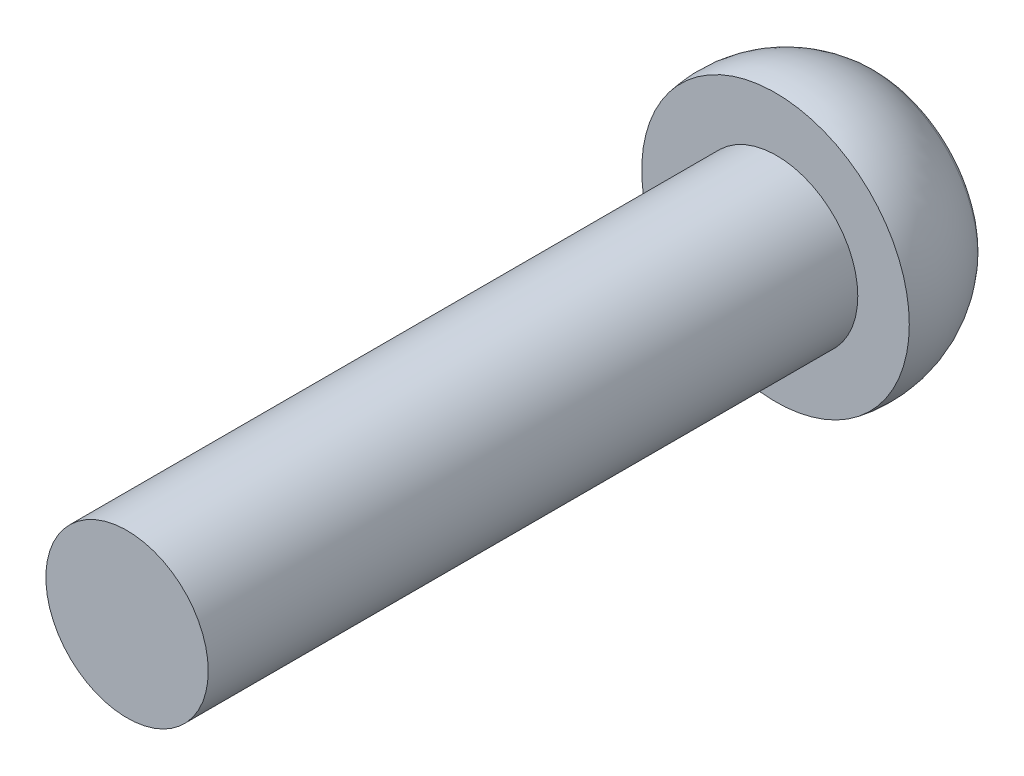
ISO-10303-21;
HEADER;
FILE_DESCRIPTION(('STEP AP214'),'2;1');
FILE_NAME('part.step','',(''),(''),'','','');
FILE_SCHEMA(('AUTOMOTIVE_DESIGN { 1 0 10303 214 1 1 1 1 }'));
ENDSEC;
DATA;
#1=APPLICATION_CONTEXT('core data for automotive mechanical design processes');
#2=APPLICATION_PROTOCOL_DEFINITION('international standard','automotive_design',2000,#1);
#3=PRODUCT_CONTEXT('',#1,'mechanical');
#4=PRODUCT('Part','Part','',(#3));
#5=PRODUCT_RELATED_PRODUCT_CATEGORY('part','',(#4));
#6=PRODUCT_DEFINITION_FORMATION('','',#4);
#7=PRODUCT_DEFINITION_CONTEXT('part definition',#1,'design');
#8=PRODUCT_DEFINITION('design','',#6,#7);
#9=PRODUCT_DEFINITION_SHAPE('','',#8);
#10=(LENGTH_UNIT() NAMED_UNIT(*) SI_UNIT(.MILLI.,.METRE.));
#11=(NAMED_UNIT(*) PLANE_ANGLE_UNIT() SI_UNIT($,.RADIAN.));
#12=(NAMED_UNIT(*) SI_UNIT($,.STERADIAN.) SOLID_ANGLE_UNIT());
#13=UNCERTAINTY_MEASURE_WITH_UNIT(LENGTH_MEASURE(1.E-05),#10,'distance_accuracy_value','');
#14=(GEOMETRIC_REPRESENTATION_CONTEXT(3) GLOBAL_UNCERTAINTY_ASSIGNED_CONTEXT((#13)) GLOBAL_UNIT_ASSIGNED_CONTEXT((#10,
#11,#12)) REPRESENTATION_CONTEXT('',''));
#15=CARTESIAN_POINT('',(0.,0.,0.));
#16=DIRECTION('',(0.,0.,1.));
#17=DIRECTION('',(1.,0.,0.));
#18=AXIS2_PLACEMENT_3D('',#15,#16,#17);
#19=CARTESIAN_POINT('',(0.,0.,0.));
#20=DIRECTION('',(0.,0.,1.));
#21=DIRECTION('',(1.,0.,0.));
#22=AXIS2_PLACEMENT_3D('',#19,#20,#21);
#23=PLANE('',#22);
#24=CARTESIAN_POINT('',(0.,0.,0.));
#25=DIRECTION('',(0.,0.,1.));
#26=DIRECTION('',(1.,0.,0.));
#27=AXIS2_PLACEMENT_3D('',#24,#25,#26);
#28=CIRCLE('',#27,1.64786324972712);
#29=CARTESIAN_POINT('',(1.64786324972712,0.,0.));
#30=VERTEX_POINT('',#29);
#31=EDGE_CURVE('E204',#30,#30,#28,.T.);
#32=ORIENTED_EDGE('',*,*,#31,.T.);
#33=EDGE_LOOP('',(#32));
#34=FACE_BOUND('',#33,.T.);
#35=CARTESIAN_POINT('',(0.0135896024399493,-0.0135896024399496,0.));
#36=DIRECTION('',(0.,0.,1.));
#37=DIRECTION('',(1.,0.,0.));
#38=AXIS2_PLACEMENT_3D('',#35,#36,#37);
#39=CIRCLE('',#38,1.);
#40=CARTESIAN_POINT('',(1.01358960243995,-0.0135896024399496,0.));
#41=VERTEX_POINT('',#40);
#42=EDGE_CURVE('E344',#41,#41,#39,.T.);
#43=ORIENTED_EDGE('',*,*,#42,.F.);
#44=EDGE_LOOP('',(#43));
#45=FACE_BOUND('',#44,.T.);
#46=ADVANCED_FACE('F35',(#34,#45),#23,.T.);
#47=CARTESIAN_POINT('',(0.,0.,-1.34074998965091));
#48=DIRECTION('',(0.,0.,-1.));
#49=DIRECTION('',(-1.,0.,0.));
#50=AXIS2_PLACEMENT_3D('',#47,#48,#49);
#51=PLANE('',#50);
#52=DIRECTION('',(0.,-1.,0.));
#53=VECTOR('',#52,1.);
#54=CARTESIAN_POINT('',(0.25,-0.25,-1.34074998965091));
#55=LINE('',#54,#53);
#56=CARTESIAN_POINT('',(0.25,-0.25,-1.34074998965091));
#57=VERTEX_POINT('',#56);
#58=CARTESIAN_POINT('',(0.25,-0.912522745887616,-1.34074998965091));
#59=VERTEX_POINT('',#58);
#60=EDGE_CURVE('E323',#57,#59,#55,.T.);
#61=ORIENTED_EDGE('',*,*,#60,.F.);
#62=DIRECTION('',(-1.,0.,0.));
#63=VECTOR('',#62,1.);
#64=CARTESIAN_POINT('',(1.,-0.25,-1.34074998965091));
#65=LINE('',#64,#63);
#66=CARTESIAN_POINT('',(0.912522745887616,-0.25,-1.34074998965091));
#67=VERTEX_POINT('',#66);
#68=EDGE_CURVE('E357',#67,#57,#65,.T.);
#69=ORIENTED_EDGE('',*,*,#68,.F.);
#70=CARTESIAN_POINT('',(0.,0.,-1.34074998965091));
#71=DIRECTION('',(0.,0.,1.));
#72=DIRECTION('',(1.,0.,0.));
#73=AXIS2_PLACEMENT_3D('',#70,#71,#72);
#74=CIRCLE('',#73,0.946148910987205);
#75=EDGE_CURVE('E210',#59,#67,#74,.T.);
#76=ORIENTED_EDGE('',*,*,#75,.F.);
#77=EDGE_LOOP('',(#61,#69,#76));
#78=FACE_BOUND('',#77,.T.);
#79=ADVANCED_FACE('F384',(#78),#51,.T.);
#80=DIRECTION('',(1.,0.,0.));
#81=VECTOR('',#80,1.);
#82=CARTESIAN_POINT('',(1.,0.25,-1.34074998965091));
#83=LINE('',#82,#81);
#84=CARTESIAN_POINT('',(0.25,0.25,-1.34074998965091));
#85=VERTEX_POINT('',#84);
#86=CARTESIAN_POINT('',(0.912522745887616,0.25,-1.34074998965091));
#87=VERTEX_POINT('',#86);
#88=EDGE_CURVE('E355',#85,#87,#83,.T.);
#89=ORIENTED_EDGE('',*,*,#88,.F.);
#90=DIRECTION('',(0.,-1.,0.));
#91=VECTOR('',#90,1.);
#92=CARTESIAN_POINT('',(0.25,1.,-1.34074998965091));
#93=LINE('',#92,#91);
#94=CARTESIAN_POINT('',(0.25,0.912522745887616,-1.34074998965091));
#95=VERTEX_POINT('',#94);
#96=EDGE_CURVE('E352',#95,#85,#93,.T.);
#97=ORIENTED_EDGE('',*,*,#96,.F.);
#98=EDGE_CURVE('E211',#87,#95,#74,.T.);
#99=ORIENTED_EDGE('',*,*,#98,.F.);
#100=EDGE_LOOP('',(#89,#97,#99));
#101=FACE_BOUND('',#100,.T.);
#102=ADVANCED_FACE('F405',(#101),#51,.T.);
#103=DIRECTION('',(0.,1.,0.));
#104=VECTOR('',#103,1.);
#105=CARTESIAN_POINT('',(-0.25,1.,-1.34074998965091));
#106=LINE('',#105,#104);
#107=CARTESIAN_POINT('',(-0.25,0.25,-1.34074998965091));
#108=VERTEX_POINT('',#107);
#109=CARTESIAN_POINT('',(-0.25,0.912522745887616,-1.34074998965091));
#110=VERTEX_POINT('',#109);
#111=EDGE_CURVE('E350',#108,#110,#106,.T.);
#112=ORIENTED_EDGE('',*,*,#111,.F.);
#113=DIRECTION('',(1.,0.,0.));
#114=VECTOR('',#113,1.);
#115=CARTESIAN_POINT('',(-0.25,0.25,-1.34074998965091));
#116=LINE('',#115,#114);
#117=CARTESIAN_POINT('',(-0.912522745887616,0.25,-1.34074998965091));
#118=VERTEX_POINT('',#117);
#119=EDGE_CURVE('E341',#118,#108,#116,.T.);
#120=ORIENTED_EDGE('',*,*,#119,.F.);
#121=EDGE_CURVE('E214',#110,#118,#74,.T.);
#122=ORIENTED_EDGE('',*,*,#121,.F.);
#123=EDGE_LOOP('',(#112,#120,#122));
#124=FACE_BOUND('',#123,.T.);
#125=ADVANCED_FACE('F393',(#124),#51,.T.);
#126=DIRECTION('',(0.,1.,0.));
#127=VECTOR('',#126,1.);
#128=CARTESIAN_POINT('',(-0.25,-0.25,-1.34074998965091));
#129=LINE('',#128,#127);
#130=CARTESIAN_POINT('',(-0.25,-0.912522745887616,-1.34074998965091));
#131=VERTEX_POINT('',#130);
#132=CARTESIAN_POINT('',(-0.25,-0.25,-1.34074998965091));
#133=VERTEX_POINT('',#132);
#134=EDGE_CURVE('E336',#131,#133,#129,.T.);
#135=ORIENTED_EDGE('',*,*,#134,.F.);
#136=CARTESIAN_POINT('',(-0.912522745887616,-0.25,-1.34074998965091));
#137=VERTEX_POINT('',#136);
#138=EDGE_CURVE('E332',#137,#131,#74,.T.);
#139=ORIENTED_EDGE('',*,*,#138,.F.);
#140=DIRECTION('',(-1.,0.,0.));
#141=VECTOR('',#140,1.);
#142=CARTESIAN_POINT('',(-0.25,-0.25,-1.34074998965091));
#143=LINE('',#142,#141);
#144=EDGE_CURVE('E54',#133,#137,#143,.T.);
#145=ORIENTED_EDGE('',*,*,#144,.F.);
#146=EDGE_LOOP('',(#135,#139,#145));
#147=FACE_BOUND('',#146,.T.);
#148=ADVANCED_FACE('F338',(#147),#51,.T.);
#149=CARTESIAN_POINT('',(0.,0.,-0.840749989650906));
#150=DIRECTION('',(0.,0.,1.));
#151=DIRECTION('',(1.,0.,0.));
#152=AXIS2_PLACEMENT_3D('',#149,#150,#151);
#153=TOROIDAL_SURFACE('',#152,0.946148910987205,0.5);
#154=CARTESIAN_POINT('',(-0.248731418139729,-1.00019999999798,-1.33355550441005));
#155=CARTESIAN_POINT('',(-0.24958614674247,-0.970985632246849,-1.33840291119549));
#156=CARTESIAN_POINT('',(-0.250008527124177,-0.941356796484875,-1.34079834937522));
#157=CARTESIAN_POINT('',(-0.249991262751628,-0.882089876302517,-1.34070043825306));
#158=CARTESIAN_POINT('',(-0.249551119047547,-0.85245179645112,-1.33820425926608));
#159=CARTESIAN_POINT('',(-0.247809665705305,-0.793993999996859,-1.32832798658651));
#160=CARTESIAN_POINT('',(-0.246507536336563,-0.765175089641474,-1.32094324397078));
#161=CARTESIAN_POINT('',(-0.243070557403056,-0.709267037425154,-1.30145116783077));
#162=CARTESIAN_POINT('',(-0.240936699840295,-0.682175879498399,-1.28934946022943));
#163=CARTESIAN_POINT('',(-0.235964122234399,-0.63141444611803,-1.26114857125648));
#164=CARTESIAN_POINT('',(-0.233151434951457,-0.607659926555948,-1.24519702900446));
#165=CARTESIAN_POINT('',(-0.226841694587375,-0.563251924748829,-1.20941271319113));
#166=CARTESIAN_POINT('',(-0.223342242870993,-0.542609773111442,-1.18956633629338));
#167=CARTESIAN_POINT('',(-0.219536364668565,-0.523969633910927,-1.16798212843628));
#168=B_SPLINE_CURVE_WITH_KNOTS('',3,(#154,#155,#156,#157,#158,#159,#160,#161,#162,#163,#164,
#165,#166,#167),.UNSPECIFIED.,.F.,.F.,(4,2,2,2,2,2,4),(0.,0.0887691650607502,0.177589696147095,
0.266494815301146,0.355294220222159,0.441116211611775,0.527243463159091),.UNSPECIFIED.);
#169=CARTESIAN_POINT('',(-0.248772653500362,-0.998772653500362,-1.33378936176114));
#170=VERTEX_POINT('',#169);
#171=EDGE_CURVE('E11',#170,#131,#168,.T.);
#172=ORIENTED_EDGE('',*,*,#171,.F.);
#173=CARTESIAN_POINT('',(0.2502,-0.998762636472414,-1.33373255237265));
#174=CARTESIAN_POINT('',(0.22935821029771,-0.998909155419599,-1.33456350261405));
#175=CARTESIAN_POINT('',(0.208510714237745,-0.99902632673639,-1.33522801417274));
#176=CARTESIAN_POINT('',(0.166810073600685,-0.999214972415781,-1.33629787698463));
#177=CARTESIAN_POINT('',(0.145956929482305,-0.999286449767193,-1.3367032451882));
#178=CARTESIAN_POINT('',(0.0834051338906349,-0.999451826949895,-1.33764114579784));
#179=CARTESIAN_POINT('',(0.0417025669453174,-0.999496738672754,-1.33789585283518));
#180=CARTESIAN_POINT('',(-0.0417025669453178,-0.999496738672754,-1.33789585283518));
#181=CARTESIAN_POINT('',(-0.0834051338906354,-0.999451826949895,-1.33764114579784));
#182=CARTESIAN_POINT('',(-0.145956929482306,-0.999286449767193,-1.3367032451882));
#183=CARTESIAN_POINT('',(-0.166810073600686,-0.999214972415781,-1.33629787698463));
#184=CARTESIAN_POINT('',(-0.208510714237745,-0.99902632673639,-1.33522801417274));
#185=CARTESIAN_POINT('',(-0.22935821029771,-0.998909155419599,-1.33456350261405));
#186=CARTESIAN_POINT('',(-0.2502,-0.998762636472414,-1.33373255237265));
#187=B_SPLINE_CURVE_WITH_KNOTS('',3,(#173,#174,#175,#176,#177,#178,#179,#180,#181,#182,#183,
#184,#185,#186),.UNSPECIFIED.,.F.,.F.,(4,2,2,2,2,2,4),(0.,0.0625742628865592,0.125144432413641,
0.250250102299897,0.375355772186154,0.437925941713235,0.500500204599794),.UNSPECIFIED.);
#188=CARTESIAN_POINT('',(0.248772653499892,-0.998772653499892,-1.33378936175847));
#189=VERTEX_POINT('',#188);
#190=EDGE_CURVE('E47',#189,#170,#187,.T.);
#191=ORIENTED_EDGE('',*,*,#190,.F.);
#192=CARTESIAN_POINT('',(0.219536364668565,-0.523969633910927,-1.16798212843628));
#193=CARTESIAN_POINT('',(0.223417162959779,-0.542973823364192,-1.18999122923084));
#194=CARTESIAN_POINT('',(0.22697935323117,-0.564063715021397,-1.210193414155));
#195=CARTESIAN_POINT('',(0.23338358711039,-0.609458557906342,-1.2465136293228));
#196=CARTESIAN_POINT('',(0.236228669439464,-0.633749255233126,-1.262648893011));
#197=CARTESIAN_POINT('',(0.241004749968007,-0.683258284015449,-1.28973539168155));
#198=CARTESIAN_POINT('',(0.24297988223307,-0.708336626868522,-1.30093692338774));
#199=CARTESIAN_POINT('',(0.246219254039212,-0.76000121173847,-1.3193083138189));
#200=CARTESIAN_POINT('',(0.247482662017373,-0.78658917782316,-1.3264734565162));
#201=CARTESIAN_POINT('',(0.249394296316473,-0.844287328167994,-1.33731487336245));
#202=CARTESIAN_POINT('',(0.249934375709412,-0.875517583212375,-1.34037781580477));
#203=CARTESIAN_POINT('',(0.250054829507455,-0.938055105897448,-1.34106094323972));
#204=CARTESIAN_POINT('',(0.249634703786009,-0.969362405183311,-1.33867829187373));
#205=CARTESIAN_POINT('',(0.248731418139729,-1.00019999999798,-1.33355550441005));
#206=B_SPLINE_CURVE_WITH_KNOTS('',3,(#192,#193,#194,#195,#196,#197,#198,#199,#200,#201,#202,
#203,#204,#205),.UNSPECIFIED.,.F.,.F.,(4,2,2,2,2,2,4),(0.,0.0878170982428003,0.175255569681402,
0.257519005261126,0.339878357327818,0.43353414273552,0.527238720237572),.UNSPECIFIED.);
#207=EDGE_CURVE('E298',#59,#189,#206,.T.);
#208=ORIENTED_EDGE('',*,*,#207,.F.);
#209=ORIENTED_EDGE('',*,*,#75,.T.);
#210=CARTESIAN_POINT('',(1.00019999999798,-0.248731418139729,-1.33355550441005));
#211=CARTESIAN_POINT('',(0.970985632246848,-0.24958614674247,-1.33840291119549));
#212=CARTESIAN_POINT('',(0.941356796484875,-0.250008527124176,-1.34079834937522));
#213=CARTESIAN_POINT('',(0.882089876302517,-0.249991262751628,-1.34070043825306));
#214=CARTESIAN_POINT('',(0.85245179645112,-0.249551119047546,-1.33820425926608));
#215=CARTESIAN_POINT('',(0.793993999996859,-0.247809665705305,-1.32832798658651));
#216=CARTESIAN_POINT('',(0.765175089641474,-0.246507536336563,-1.32094324397078));
#217=CARTESIAN_POINT('',(0.709267037425154,-0.243070557403056,-1.30145116783077));
#218=CARTESIAN_POINT('',(0.682175879498399,-0.240936699840295,-1.28934946022943));
#219=CARTESIAN_POINT('',(0.631414446117999,-0.235964122234396,-1.26114857125646));
#220=CARTESIAN_POINT('',(0.60765992655589,-0.23315143495145,-1.24519702900442));
#221=CARTESIAN_POINT('',(0.563251924748724,-0.226841694587359,-1.20941271319104));
#222=CARTESIAN_POINT('',(0.542609773111318,-0.223342242870971,-1.18956633629326));
#223=CARTESIAN_POINT('',(0.52396963391079,-0.219536364668537,-1.16798212843612));
#224=B_SPLINE_CURVE_WITH_KNOTS('',3,(#210,#211,#212,#213,#214,#215,#216,#217,#218,#219,#220,
#221,#222,#223),.UNSPECIFIED.,.F.,.F.,(4,2,2,2,2,2,4),(0.,0.0887691650607503,0.177589696147095,
0.266494815301146,0.355294220222159,0.441116211611879,0.527243463159302),.UNSPECIFIED.);
#225=CARTESIAN_POINT('',(0.998772653500362,-0.248772653500362,-1.33378936176114));
#226=VERTEX_POINT('',#225);
#227=EDGE_CURVE('E293',#226,#67,#224,.T.);
#228=ORIENTED_EDGE('',*,*,#227,.F.);
#229=CARTESIAN_POINT('',(0.998762636472414,0.2502,-1.33373255237265));
#230=CARTESIAN_POINT('',(0.998909155419599,0.22935821029771,-1.33456350261405));
#231=CARTESIAN_POINT('',(0.99902632673639,0.208510714237745,-1.33522801417274));
#232=CARTESIAN_POINT('',(0.999214972415781,0.166810073600685,-1.33629787698463));
#233=CARTESIAN_POINT('',(0.999286449767193,0.145956929482306,-1.3367032451882));
#234=CARTESIAN_POINT('',(0.999451826949894,0.0834051338906351,-1.33764114579784));
#235=CARTESIAN_POINT('',(0.999496738672753,0.0417025669453175,-1.33789585283518));
#236=CARTESIAN_POINT('',(0.999496738672753,-0.0417025669453176,-1.33789585283518));
#237=CARTESIAN_POINT('',(0.999451826949894,-0.0834051338906352,-1.33764114579784));
#238=CARTESIAN_POINT('',(0.999286449767193,-0.145956929482306,-1.3367032451882));
#239=CARTESIAN_POINT('',(0.999214972415781,-0.166810073600686,-1.33629787698463));
#240=CARTESIAN_POINT('',(0.99902632673639,-0.208510714237745,-1.33522801417274));
#241=CARTESIAN_POINT('',(0.998909155419599,-0.22935821029771,-1.33456350261405));
#242=CARTESIAN_POINT('',(0.998762636472414,-0.2502,-1.33373255237265));
#243=B_SPLINE_CURVE_WITH_KNOTS('',3,(#229,#230,#231,#232,#233,#234,#235,#236,#237,#238,#239,
#240,#241,#242),.UNSPECIFIED.,.F.,.F.,(4,2,2,2,2,2,4),(0.,0.0625742628865592,0.125144432413641,
0.250250102299897,0.375355772186154,0.437925941713235,0.500500204599794),.UNSPECIFIED.);
#244=CARTESIAN_POINT('',(0.998772653499892,0.248772653499892,-1.33378936175847));
#245=VERTEX_POINT('',#244);
#246=EDGE_CURVE('E288',#245,#226,#243,.T.);
#247=ORIENTED_EDGE('',*,*,#246,.F.);
#248=CARTESIAN_POINT('',(0.52396963391079,0.219536364668537,-1.16798212843612));
#249=CARTESIAN_POINT('',(0.542973823364044,0.223417162959752,-1.18999122923069));
#250=CARTESIAN_POINT('',(0.564063715021239,0.226979353231145,-1.21019341415486));
#251=CARTESIAN_POINT('',(0.609458557906166,0.233383587110368,-1.24651362932268));
#252=CARTESIAN_POINT('',(0.633749255232941,0.236228669439444,-1.26264889301088));
#253=CARTESIAN_POINT('',(0.683258284015249,0.24100474996799,-1.28973539168145));
#254=CARTESIAN_POINT('',(0.708336626868314,0.242979882233055,-1.30093692338765));
#255=CARTESIAN_POINT('',(0.76000121173825,0.246219254039201,-1.31930831381883));
#256=CARTESIAN_POINT('',(0.786589177822934,0.247482662017364,-1.32647345651615));
#257=CARTESIAN_POINT('',(0.844287328167799,0.249394296316469,-1.33731487336242));
#258=CARTESIAN_POINT('',(0.875517583212219,0.249934375709411,-1.34037781580476));
#259=CARTESIAN_POINT('',(0.93805510589737,0.250054829507456,-1.34106094323972));
#260=CARTESIAN_POINT('',(0.969362405183272,0.24963470378601,-1.33867829187373));
#261=CARTESIAN_POINT('',(1.00019999999798,0.248731418139729,-1.33355550441005));
#262=B_SPLINE_CURVE_WITH_KNOTS('',3,(#248,#249,#250,#251,#252,#253,#254,#255,#256,#257,#258,
#259,#260,#261),.UNSPECIFIED.,.F.,.F.,(4,2,2,2,2,2,4),(0.,0.0878170982427962,0.175255569681394,
0.25751900526111,0.339878357327794,0.433534142735613,0.527238720237782),.UNSPECIFIED.);
#263=EDGE_CURVE('E283',#87,#245,#262,.T.);
#264=ORIENTED_EDGE('',*,*,#263,.F.);
#265=ORIENTED_EDGE('',*,*,#98,.T.);
#266=CARTESIAN_POINT('',(0.248731418139729,1.00019999999798,-1.33355550441005));
#267=CARTESIAN_POINT('',(0.24958614674247,0.970985632246848,-1.33840291119549));
#268=CARTESIAN_POINT('',(0.250008527124176,0.941356796484875,-1.34079834937522));
#269=CARTESIAN_POINT('',(0.249991262751628,0.882089876302516,-1.34070043825306));
#270=CARTESIAN_POINT('',(0.249551119047547,0.85245179645112,-1.33820425926608));
#271=CARTESIAN_POINT('',(0.247809665705305,0.793993999996859,-1.32832798658651));
#272=CARTESIAN_POINT('',(0.246507536336563,0.765175089641474,-1.32094324397078));
#273=CARTESIAN_POINT('',(0.243070557403056,0.709267037425154,-1.30145116783077));
#274=CARTESIAN_POINT('',(0.240936699840295,0.682175879498399,-1.28934946022943));
#275=CARTESIAN_POINT('',(0.235964122234396,0.631414446117999,-1.26114857125646));
#276=CARTESIAN_POINT('',(0.23315143495145,0.60765992655589,-1.24519702900442));
#277=CARTESIAN_POINT('',(0.226841694587359,0.563251924748724,-1.20941271319104));
#278=CARTESIAN_POINT('',(0.223342242870971,0.542609773111318,-1.18956633629326));
#279=CARTESIAN_POINT('',(0.219536364668537,0.523969633910789,-1.16798212843612));
#280=B_SPLINE_CURVE_WITH_KNOTS('',3,(#266,#267,#268,#269,#270,#271,#272,#273,#274,#275,#276,
#277,#278,#279),.UNSPECIFIED.,.F.,.F.,(4,2,2,2,2,2,4),(0.,0.0887691650607504,0.177589696147095,
0.266494815301146,0.355294220222159,0.441116211611879,0.527243463159301),.UNSPECIFIED.);
#281=CARTESIAN_POINT('',(0.248772653500362,0.998772653500362,-1.33378936176114));
#282=VERTEX_POINT('',#281);
#283=EDGE_CURVE('E260',#282,#95,#280,.T.);
#284=ORIENTED_EDGE('',*,*,#283,.F.);
#285=CARTESIAN_POINT('',(-0.2502,0.998762636472413,-1.33373255237265));
#286=CARTESIAN_POINT('',(-0.22935821029771,0.998909155419599,-1.33456350261405));
#287=CARTESIAN_POINT('',(-0.208510714237745,0.999026326736389,-1.33522801417274));
#288=CARTESIAN_POINT('',(-0.166810073600685,0.999214972415781,-1.33629787698463));
#289=CARTESIAN_POINT('',(-0.145956929482306,0.999286449767193,-1.3367032451882));
#290=CARTESIAN_POINT('',(-0.0834051338906351,0.999451826949894,-1.33764114579784));
#291=CARTESIAN_POINT('',(-0.0417025669453175,0.999496738672753,-1.33789585283518));
#292=CARTESIAN_POINT('',(0.0417025669453176,0.999496738672753,-1.33789585283518));
#293=CARTESIAN_POINT('',(0.0834051338906352,0.999451826949894,-1.33764114579784));
#294=CARTESIAN_POINT('',(0.145956929482306,0.999286449767193,-1.3367032451882));
#295=CARTESIAN_POINT('',(0.166810073600686,0.999214972415781,-1.33629787698463));
#296=CARTESIAN_POINT('',(0.208510714237745,0.999026326736389,-1.33522801417274));
#297=CARTESIAN_POINT('',(0.22935821029771,0.998909155419599,-1.33456350261405));
#298=CARTESIAN_POINT('',(0.2502,0.998762636472413,-1.33373255237265));
#299=B_SPLINE_CURVE_WITH_KNOTS('',3,(#285,#286,#287,#288,#289,#290,#291,#292,#293,#294,#295,
#296,#297,#298),.UNSPECIFIED.,.F.,.F.,(4,2,2,2,2,2,4),(0.,0.0625742628865592,0.125144432413641,
0.250250102299897,0.375355772186154,0.437925941713235,0.500500204599794),.UNSPECIFIED.);
#300=CARTESIAN_POINT('',(-0.248772653499892,0.998772653499892,-1.33378936175847));
#301=VERTEX_POINT('',#300);
#302=EDGE_CURVE('E255',#301,#282,#299,.T.);
#303=ORIENTED_EDGE('',*,*,#302,.F.);
#304=CARTESIAN_POINT('',(-0.219536364668537,0.52396963391079,-1.16798212843612));
#305=CARTESIAN_POINT('',(-0.223417162959752,0.542973823364044,-1.18999122923069));
#306=CARTESIAN_POINT('',(-0.226979353231145,0.564063715021239,-1.21019341415486));
#307=CARTESIAN_POINT('',(-0.233383587110368,0.609458557906166,-1.24651362932268));
#308=CARTESIAN_POINT('',(-0.236228669439444,0.633749255232941,-1.26264889301088));
#309=CARTESIAN_POINT('',(-0.24100474996799,0.683258284015249,-1.28973539168145));
#310=CARTESIAN_POINT('',(-0.242979882233055,0.708336626868314,-1.30093692338765));
#311=CARTESIAN_POINT('',(-0.246219254039201,0.76000121173825,-1.31930831381883));
#312=CARTESIAN_POINT('',(-0.247482662017364,0.786589177822934,-1.32647345651615));
#313=CARTESIAN_POINT('',(-0.249394296316469,0.844287328167799,-1.33731487336242));
#314=CARTESIAN_POINT('',(-0.249934375709411,0.875517583212218,-1.34037781580476));
#315=CARTESIAN_POINT('',(-0.250054829507456,0.938055105897369,-1.34106094323972));
#316=CARTESIAN_POINT('',(-0.24963470378601,0.969362405183272,-1.33867829187373));
#317=CARTESIAN_POINT('',(-0.248731418139729,1.00019999999798,-1.33355550441005));
#318=B_SPLINE_CURVE_WITH_KNOTS('',3,(#304,#305,#306,#307,#308,#309,#310,#311,#312,#313,#314,
#315,#316,#317),.UNSPECIFIED.,.F.,.F.,(4,2,2,2,2,2,4),(0.,0.0878170982427962,0.175255569681394,
0.25751900526111,0.339878357327794,0.433534142735613,0.527238720237782),.UNSPECIFIED.);
#319=EDGE_CURVE('E250',#110,#301,#318,.T.);
#320=ORIENTED_EDGE('',*,*,#319,.F.);
#321=ORIENTED_EDGE('',*,*,#121,.T.);
#322=CARTESIAN_POINT('',(-1.00019999999798,0.248731418139729,-1.33355550441005));
#323=CARTESIAN_POINT('',(-0.970985632246848,0.24958614674247,-1.33840291119549));
#324=CARTESIAN_POINT('',(-0.941356796484875,0.250008527124176,-1.34079834937522));
#325=CARTESIAN_POINT('',(-0.882089876302517,0.249991262751628,-1.34070043825306));
#326=CARTESIAN_POINT('',(-0.85245179645112,0.249551119047546,-1.33820425926608));
#327=CARTESIAN_POINT('',(-0.793993999996859,0.247809665705305,-1.32832798658651));
#328=CARTESIAN_POINT('',(-0.765175089641474,0.246507536336563,-1.32094324397078));
#329=CARTESIAN_POINT('',(-0.709267037425154,0.243070557403056,-1.30145116783077));
#330=CARTESIAN_POINT('',(-0.682175879498399,0.240936699840295,-1.28934946022943));
#331=CARTESIAN_POINT('',(-0.63141444611803,0.235964122234399,-1.26114857125648));
#332=CARTESIAN_POINT('',(-0.607659926555948,0.233151434951457,-1.24519702900446));
#333=CARTESIAN_POINT('',(-0.563251924748829,0.226841694587375,-1.20941271319113));
#334=CARTESIAN_POINT('',(-0.542609773111442,0.223342242870993,-1.18956633629338));
#335=CARTESIAN_POINT('',(-0.523969633910927,0.219536364668565,-1.16798212843628));
#336=B_SPLINE_CURVE_WITH_KNOTS('',3,(#322,#323,#324,#325,#326,#327,#328,#329,#330,#331,#332,
#333,#334,#335),.UNSPECIFIED.,.F.,.F.,(4,2,2,2,2,2,4),(0.,0.0887691650607503,0.177589696147095,
0.266494815301146,0.355294220222159,0.441116211611775,0.527243463159091),.UNSPECIFIED.);
#337=CARTESIAN_POINT('',(-0.998772653500362,0.248772653500362,-1.33378936176114));
#338=VERTEX_POINT('',#337);
#339=EDGE_CURVE('E245',#338,#118,#336,.T.);
#340=ORIENTED_EDGE('',*,*,#339,.F.);
#341=CARTESIAN_POINT('',(-0.998762636472414,-0.2502,-1.33373255237265));
#342=CARTESIAN_POINT('',(-0.998909155419599,-0.22935821029771,-1.33456350261405));
#343=CARTESIAN_POINT('',(-0.99902632673639,-0.208510714237745,-1.33522801417274));
#344=CARTESIAN_POINT('',(-0.999214972415781,-0.166810073600686,-1.33629787698463));
#345=CARTESIAN_POINT('',(-0.999286449767193,-0.145956929482306,-1.3367032451882));
#346=CARTESIAN_POINT('',(-0.999451826949894,-0.0834051338906352,-1.33764114579784));
#347=CARTESIAN_POINT('',(-0.999496738672753,-0.0417025669453176,-1.33789585283518));
#348=CARTESIAN_POINT('',(-0.999496738672753,0.0417025669453176,-1.33789585283518));
#349=CARTESIAN_POINT('',(-0.999451826949894,0.0834051338906352,-1.33764114579784));
#350=CARTESIAN_POINT('',(-0.999286449767193,0.145956929482306,-1.3367032451882));
#351=CARTESIAN_POINT('',(-0.999214972415781,0.166810073600686,-1.33629787698463));
#352=CARTESIAN_POINT('',(-0.99902632673639,0.208510714237745,-1.33522801417274));
#353=CARTESIAN_POINT('',(-0.998909155419599,0.22935821029771,-1.33456350261405));
#354=CARTESIAN_POINT('',(-0.998762636472414,0.2502,-1.33373255237265));
#355=B_SPLINE_CURVE_WITH_KNOTS('',3,(#341,#342,#343,#344,#345,#346,#347,#348,#349,#350,#351,
#352,#353,#354),.UNSPECIFIED.,.F.,.F.,(4,2,2,2,2,2,4),(0.,0.0625742628865592,0.125144432413641,
0.250250102299897,0.375355772186154,0.437925941713235,0.500500204599794),.UNSPECIFIED.);
#356=CARTESIAN_POINT('',(-0.998772653499892,-0.248772653499892,-1.33378936175847));
#357=VERTEX_POINT('',#356);
#358=EDGE_CURVE('E220',#357,#338,#355,.T.);
#359=ORIENTED_EDGE('',*,*,#358,.F.);
#360=CARTESIAN_POINT('',(-0.523969633910927,-0.219536364668565,-1.16798212843628));
#361=CARTESIAN_POINT('',(-0.542973823364192,-0.223417162959779,-1.18999122923084));
#362=CARTESIAN_POINT('',(-0.564063715021396,-0.226979353231171,-1.210193414155));
#363=CARTESIAN_POINT('',(-0.609458557906342,-0.23338358711039,-1.2465136293228));
#364=CARTESIAN_POINT('',(-0.633749255233126,-0.236228669439465,-1.262648893011));
#365=CARTESIAN_POINT('',(-0.683258284015449,-0.241004749968007,-1.28973539168155));
#366=CARTESIAN_POINT('',(-0.708336626868522,-0.24297988223307,-1.30093692338774));
#367=CARTESIAN_POINT('',(-0.76000121173847,-0.246219254039213,-1.3193083138189));
#368=CARTESIAN_POINT('',(-0.78658917782316,-0.247482662017374,-1.3264734565162));
#369=CARTESIAN_POINT('',(-0.844287328167994,-0.249394296316473,-1.33731487336245));
#370=CARTESIAN_POINT('',(-0.875517583212375,-0.249934375709413,-1.34037781580477));
#371=CARTESIAN_POINT('',(-0.938055105897448,-0.250054829507455,-1.34106094323972));
#372=CARTESIAN_POINT('',(-0.96936240518331,-0.249634703786009,-1.33867829187373));
#373=CARTESIAN_POINT('',(-1.00019999999798,-0.248731418139729,-1.33355550441005));
#374=B_SPLINE_CURVE_WITH_KNOTS('',3,(#360,#361,#362,#363,#364,#365,#366,#367,#368,#369,#370,
#371,#372,#373),.UNSPECIFIED.,.F.,.F.,(4,2,2,2,2,2,4),(0.,0.0878170982428004,0.175255569681402,
0.257519005261125,0.339878357327818,0.43353414273552,0.527238720237571),.UNSPECIFIED.);
#375=EDGE_CURVE('E165',#137,#357,#374,.T.);
#376=ORIENTED_EDGE('',*,*,#375,.F.);
#377=ORIENTED_EDGE('',*,*,#138,.T.);
#378=EDGE_LOOP('',(#172,#191,#208,#209,#228,#247,#264,#265,#284,#303,#320,#321,#340,#359,#376,#377));
#379=FACE_BOUND('',#378,.T.);
#380=CARTESIAN_POINT('',(0.,0.,-1.16818212843628));
#381=DIRECTION('',(0.,0.,1.));
#382=DIRECTION('',(1.,0.,0.));
#383=AXIS2_PLACEMENT_3D('',#380,#381,#382);
#384=CIRCLE('',#383,1.32402216287259);
#385=CARTESIAN_POINT('',(1.32402216287259,0.,-1.16818212843628));
#386=VERTEX_POINT('',#385);
#387=EDGE_CURVE('E207',#386,#386,#384,.T.);
#388=ORIENTED_EDGE('',*,*,#387,.F.);
#389=EDGE_LOOP('',(#388));
#390=FACE_BOUND('',#389,.T.);
#391=ADVANCED_FACE('F226',(#379,#390),#153,.T.);
#392=CARTESIAN_POINT('',(0.,0.,-0.243317919784356));
#393=DIRECTION('',(0.,0.,1.));
#394=DIRECTION('',(1.,0.,0.));
#395=AXIS2_PLACEMENT_3D('',#392,#393,#394);
#396=DEGENERATE_TOROIDAL_SURFACE('',#395,0.256682080215679,1.41229906765225,.T.);
#397=ORIENTED_EDGE('',*,*,#387,.T.);
#398=EDGE_LOOP('',(#397));
#399=FACE_BOUND('',#398,.T.);
#400=ORIENTED_EDGE('',*,*,#31,.F.);
#401=EDGE_LOOP('',(#400));
#402=FACE_BOUND('',#401,.T.);
#403=ADVANCED_FACE('F315',(#399,#402),#396,.T.);
#404=CARTESIAN_POINT('',(-0.25,-0.25,-1.34074998965091));
#405=DIRECTION('',(-0.984807753012208,0.,0.173648177666931));
#406=DIRECTION('',(0.173648177666931,0.,0.984807753012208));
#407=AXIS2_PLACEMENT_3D('',#404,#405,#406);
#408=PLANE('',#407);
#409=DIRECTION('',(0.,-1.,0.));
#410=VECTOR('',#409,1.);
#411=CARTESIAN_POINT('',(-0.0135896024399495,0.,0.));
#412=LINE('',#411,#410);
#413=CARTESIAN_POINT('',(-0.0135896024399495,-0.0135896024399496,0.));
#414=VERTEX_POINT('',#413);
#415=CARTESIAN_POINT('',(-0.0135896024399495,-0.76358960243995,0.));
#416=VERTEX_POINT('',#415);
#417=EDGE_CURVE('E158',#414,#416,#412,.T.);
#418=ORIENTED_EDGE('',*,*,#417,.T.);
#419=DIRECTION('',(-0.171087869746036,-0.171087869746036,-0.970287525247814));
#420=VECTOR('',#419,1.);
#421=CARTESIAN_POINT('',(-0.235364470412882,-0.985364470412882,-1.25774777678301));
#422=LINE('',#421,#420);
#423=EDGE_CURVE('E160',#416,#170,#422,.T.);
#424=ORIENTED_EDGE('',*,*,#423,.T.);
#425=ORIENTED_EDGE('',*,*,#171,.T.);
#426=ORIENTED_EDGE('',*,*,#134,.T.);
#427=DIRECTION('',(-0.171087869746036,-0.171087869746036,-0.970287525247814));
#428=VECTOR('',#427,1.);
#429=CARTESIAN_POINT('',(-0.25,-0.25,-1.34074998965091));
#430=LINE('',#429,#428);
#431=EDGE_CURVE('E169',#414,#133,#430,.T.);
#432=ORIENTED_EDGE('',*,*,#431,.F.);
#433=EDGE_LOOP('',(#418,#424,#425,#426,#432));
#434=FACE_BOUND('',#433,.T.);
#435=ADVANCED_FACE('F231',(#434),#408,.F.);
#436=CARTESIAN_POINT('',(0.25,-1.,-1.34074998965091));
#437=DIRECTION('',(0.,-0.984807753012208,0.173648177666931));
#438=DIRECTION('',(0.,-0.173648177666931,-0.984807753012208));
#439=AXIS2_PLACEMENT_3D('',#436,#437,#438);
#440=PLANE('',#439);
#441=DIRECTION('',(1.,0.,0.));
#442=VECTOR('',#441,1.);
#443=CARTESIAN_POINT('',(0.,-0.76358960243995,0.));
#444=LINE('',#443,#442);
#445=CARTESIAN_POINT('',(0.0135896024399494,-0.76358960243995,0.));
#446=VERTEX_POINT('',#445);
#447=EDGE_CURVE('E200',#416,#446,#444,.T.);
#448=ORIENTED_EDGE('',*,*,#447,.T.);
#449=DIRECTION('',(0.171087869746036,-0.171087869746036,-0.970287525247814));
#450=VECTOR('',#449,1.);
#451=CARTESIAN_POINT('',(0.228046705619322,-0.978046705619323,-1.21624667034905));
#452=LINE('',#451,#450);
#453=EDGE_CURVE('E321',#446,#189,#452,.T.);
#454=ORIENTED_EDGE('',*,*,#453,.T.);
#455=ORIENTED_EDGE('',*,*,#190,.T.);
#456=ORIENTED_EDGE('',*,*,#423,.F.);
#457=EDGE_LOOP('',(#448,#454,#455,#456));
#458=FACE_BOUND('',#457,.T.);
#459=ADVANCED_FACE('F311',(#458),#440,.F.);
#460=CARTESIAN_POINT('',(0.25,-0.25,-1.34074998965091));
#461=DIRECTION('',(0.984807753012208,0.,0.173648177666931));
#462=DIRECTION('',(0.173648177666931,0.,-0.984807753012208));
#463=AXIS2_PLACEMENT_3D('',#460,#461,#462);
#464=PLANE('',#463);
#465=DIRECTION('',(0.,1.,0.));
#466=VECTOR('',#465,1.);
#467=CARTESIAN_POINT('',(0.0135896024399493,0.,0.));
#468=LINE('',#467,#466);
#469=CARTESIAN_POINT('',(0.0135896024399493,-0.0135896024399496,0.));
#470=VERTEX_POINT('',#469);
#471=EDGE_CURVE('E197',#446,#470,#468,.T.);
#472=ORIENTED_EDGE('',*,*,#471,.T.);
#473=DIRECTION('',(0.171087869746036,-0.171087869746036,-0.970287525247814));
#474=VECTOR('',#473,1.);
#475=CARTESIAN_POINT('',(0.25,-0.25,-1.34074998965091));
#476=LINE('',#475,#474);
#477=EDGE_CURVE('E327',#470,#57,#476,.T.);
#478=ORIENTED_EDGE('',*,*,#477,.T.);
#479=ORIENTED_EDGE('',*,*,#60,.T.);
#480=ORIENTED_EDGE('',*,*,#207,.T.);
#481=ORIENTED_EDGE('',*,*,#453,.F.);
#482=EDGE_LOOP('',(#472,#478,#479,#480,#481));
#483=FACE_BOUND('',#482,.T.);
#484=ADVANCED_FACE('F306',(#483),#464,.F.);
#485=CARTESIAN_POINT('',(1.,-0.25,-1.34074998965091));
#486=DIRECTION('',(0.,-0.984807753012208,0.173648177666931));
#487=DIRECTION('',(0.,-0.173648177666931,-0.984807753012208));
#488=AXIS2_PLACEMENT_3D('',#485,#486,#487);
#489=PLANE('',#488);
#490=DIRECTION('',(1.,0.,0.));
#491=VECTOR('',#490,1.);
#492=CARTESIAN_POINT('',(0.,-0.0135896024399496,0.));
#493=LINE('',#492,#491);
#494=CARTESIAN_POINT('',(0.76358960243995,-0.0135896024399496,0.));
#495=VERTEX_POINT('',#494);
#496=EDGE_CURVE('E194',#470,#495,#493,.T.);
#497=ORIENTED_EDGE('',*,*,#496,.T.);
#498=DIRECTION('',(0.171087869746036,-0.171087869746036,-0.970287525247814));
#499=VECTOR('',#498,1.);
#500=CARTESIAN_POINT('',(0.985364470412882,-0.235364470412882,-1.25774777678301));
#501=LINE('',#500,#499);
#502=EDGE_CURVE('E377',#495,#226,#501,.T.);
#503=ORIENTED_EDGE('',*,*,#502,.T.);
#504=ORIENTED_EDGE('',*,*,#227,.T.);
#505=ORIENTED_EDGE('',*,*,#68,.T.);
#506=ORIENTED_EDGE('',*,*,#477,.F.);
#507=EDGE_LOOP('',(#497,#503,#504,#505,#506));
#508=FACE_BOUND('',#507,.T.);
#509=ADVANCED_FACE('F303',(#508),#489,.F.);
#510=CARTESIAN_POINT('',(1.,0.25,-1.34074998965091));
#511=DIRECTION('',(0.984807753012208,0.,0.173648177666931));
#512=DIRECTION('',(0.173648177666931,0.,-0.984807753012208));
#513=AXIS2_PLACEMENT_3D('',#510,#511,#512);
#514=PLANE('',#513);
#515=DIRECTION('',(0.,1.,0.));
#516=VECTOR('',#515,1.);
#517=CARTESIAN_POINT('',(0.76358960243995,0.,0.));
#518=LINE('',#517,#516);
#519=CARTESIAN_POINT('',(0.76358960243995,0.0135896024399495,0.));
#520=VERTEX_POINT('',#519);
#521=EDGE_CURVE('E191',#495,#520,#518,.T.);
#522=ORIENTED_EDGE('',*,*,#521,.T.);
#523=DIRECTION('',(0.171087869746036,0.171087869746036,-0.970287525247814));
#524=VECTOR('',#523,1.);
#525=CARTESIAN_POINT('',(1.,0.25,-1.34074998965091));
#526=LINE('',#525,#524);
#527=EDGE_CURVE('E374',#520,#245,#526,.T.);
#528=ORIENTED_EDGE('',*,*,#527,.T.);
#529=ORIENTED_EDGE('',*,*,#246,.T.);
#530=ORIENTED_EDGE('',*,*,#502,.F.);
#531=EDGE_LOOP('',(#522,#528,#529,#530));
#532=FACE_BOUND('',#531,.T.);
#533=ADVANCED_FACE('F279',(#532),#514,.F.);
#534=CARTESIAN_POINT('',(1.,0.25,-1.34074998965091));
#535=DIRECTION('',(0.,0.984807753012208,0.173648177666931));
#536=DIRECTION('',(0.,-0.173648177666931,0.984807753012208));
#537=AXIS2_PLACEMENT_3D('',#534,#535,#536);
#538=PLANE('',#537);
#539=DIRECTION('',(-1.,0.,0.));
#540=VECTOR('',#539,1.);
#541=CARTESIAN_POINT('',(0.,0.0135896024399496,0.));
#542=LINE('',#541,#540);
#543=CARTESIAN_POINT('',(0.0135896024399494,0.0135896024399495,0.));
#544=VERTEX_POINT('',#543);
#545=EDGE_CURVE('E188',#520,#544,#542,.T.);
#546=ORIENTED_EDGE('',*,*,#545,.T.);
#547=DIRECTION('',(0.171087869746036,0.171087869746036,-0.970287525247814));
#548=VECTOR('',#547,1.);
#549=CARTESIAN_POINT('',(0.271953294380677,0.271953294380677,-1.46525330895276));
#550=LINE('',#549,#548);
#551=EDGE_CURVE('E372',#544,#85,#550,.T.);
#552=ORIENTED_EDGE('',*,*,#551,.T.);
#553=ORIENTED_EDGE('',*,*,#88,.T.);
#554=ORIENTED_EDGE('',*,*,#263,.T.);
#555=ORIENTED_EDGE('',*,*,#527,.F.);
#556=EDGE_LOOP('',(#546,#552,#553,#554,#555));
#557=FACE_BOUND('',#556,.T.);
#558=ADVANCED_FACE('F274',(#557),#538,.F.);
#559=CARTESIAN_POINT('',(0.25,1.,-1.34074998965091));
#560=DIRECTION('',(0.984807753012208,0.,0.173648177666931));
#561=DIRECTION('',(0.173648177666931,0.,-0.984807753012208));
#562=AXIS2_PLACEMENT_3D('',#559,#560,#561);
#563=PLANE('',#562);
#564=DIRECTION('',(0.,1.,0.));
#565=VECTOR('',#564,1.);
#566=CARTESIAN_POINT('',(0.0135896024399494,0.,0.));
#567=LINE('',#566,#565);
#568=CARTESIAN_POINT('',(0.0135896024399495,0.763589602439949,0.));
#569=VERTEX_POINT('',#568);
#570=EDGE_CURVE('E185',#544,#569,#567,.T.);
#571=ORIENTED_EDGE('',*,*,#570,.T.);
#572=DIRECTION('',(0.171087869746036,0.171087869746036,-0.970287525247814));
#573=VECTOR('',#572,1.);
#574=CARTESIAN_POINT('',(0.25,1.,-1.34074998965091));
#575=LINE('',#574,#573);
#576=EDGE_CURVE('E369',#569,#282,#575,.T.);
#577=ORIENTED_EDGE('',*,*,#576,.T.);
#578=ORIENTED_EDGE('',*,*,#283,.T.);
#579=ORIENTED_EDGE('',*,*,#96,.T.);
#580=ORIENTED_EDGE('',*,*,#551,.F.);
#581=EDGE_LOOP('',(#571,#577,#578,#579,#580));
#582=FACE_BOUND('',#581,.T.);
#583=ADVANCED_FACE('F269',(#582),#563,.F.);
#584=CARTESIAN_POINT('',(0.25,1.,-1.34074998965091));
#585=DIRECTION('',(0.,0.984807753012208,0.173648177666931));
#586=DIRECTION('',(0.,-0.173648177666931,0.984807753012208));
#587=AXIS2_PLACEMENT_3D('',#584,#585,#586);
#588=PLANE('',#587);
#589=DIRECTION('',(-1.,0.,0.));
#590=VECTOR('',#589,1.);
#591=CARTESIAN_POINT('',(0.,0.763589602439949,0.));
#592=LINE('',#591,#590);
#593=CARTESIAN_POINT('',(-0.0135896024399496,0.763589602439949,0.));
#594=VERTEX_POINT('',#593);
#595=EDGE_CURVE('E182',#569,#594,#592,.T.);
#596=ORIENTED_EDGE('',*,*,#595,.T.);
#597=DIRECTION('',(-0.171087869746036,0.171087869746036,-0.970287525247814));
#598=VECTOR('',#597,1.);
#599=CARTESIAN_POINT('',(-0.25,1.,-1.34074998965091));
#600=LINE('',#599,#598);
#601=EDGE_CURVE('E366',#594,#301,#600,.T.);
#602=ORIENTED_EDGE('',*,*,#601,.T.);
#603=ORIENTED_EDGE('',*,*,#302,.T.);
#604=ORIENTED_EDGE('',*,*,#576,.F.);
#605=EDGE_LOOP('',(#596,#602,#603,#604));
#606=FACE_BOUND('',#605,.T.);
#607=ADVANCED_FACE('F266',(#606),#588,.F.);
#608=CARTESIAN_POINT('',(-0.25,1.,-1.34074998965091));
#609=DIRECTION('',(-0.984807753012208,0.,0.173648177666931));
#610=DIRECTION('',(0.173648177666931,0.,0.984807753012208));
#611=AXIS2_PLACEMENT_3D('',#608,#609,#610);
#612=PLANE('',#611);
#613=DIRECTION('',(0.,-1.,0.));
#614=VECTOR('',#613,1.);
#615=CARTESIAN_POINT('',(-0.0135896024399496,0.,0.));
#616=LINE('',#615,#614);
#617=CARTESIAN_POINT('',(-0.0135896024399495,0.0135896024399496,0.));
#618=VERTEX_POINT('',#617);
#619=EDGE_CURVE('E176',#594,#618,#616,.T.);
#620=ORIENTED_EDGE('',*,*,#619,.T.);
#621=DIRECTION('',(-0.171087869746036,0.171087869746036,-0.970287525247814));
#622=VECTOR('',#621,1.);
#623=CARTESIAN_POINT('',(-0.271953294380677,0.271953294380678,-1.46525330895276));
#624=LINE('',#623,#622);
#625=EDGE_CURVE('E364',#618,#108,#624,.T.);
#626=ORIENTED_EDGE('',*,*,#625,.T.);
#627=ORIENTED_EDGE('',*,*,#111,.T.);
#628=ORIENTED_EDGE('',*,*,#319,.T.);
#629=ORIENTED_EDGE('',*,*,#601,.F.);
#630=EDGE_LOOP('',(#620,#626,#627,#628,#629));
#631=FACE_BOUND('',#630,.T.);
#632=ADVANCED_FACE('F241',(#631),#612,.F.);
#633=CARTESIAN_POINT('',(-0.25,0.25,-1.34074998965091));
#634=DIRECTION('',(0.,0.984807753012208,0.173648177666931));
#635=DIRECTION('',(0.,-0.173648177666931,0.984807753012208));
#636=AXIS2_PLACEMENT_3D('',#633,#634,#635);
#637=PLANE('',#636);
#638=DIRECTION('',(-1.,0.,0.));
#639=VECTOR('',#638,1.);
#640=CARTESIAN_POINT('',(0.,0.0135896024399496,0.));
#641=LINE('',#640,#639);
#642=CARTESIAN_POINT('',(-0.76358960243995,0.0135896024399495,0.));
#643=VERTEX_POINT('',#642);
#644=EDGE_CURVE('E174',#618,#643,#641,.T.);
#645=ORIENTED_EDGE('',*,*,#644,.T.);
#646=DIRECTION('',(-0.171087869746036,0.171087869746036,-0.970287525247814));
#647=VECTOR('',#646,1.);
#648=CARTESIAN_POINT('',(-1.,0.25,-1.34074998965091));
#649=LINE('',#648,#647);
#650=EDGE_CURVE('E168',#643,#338,#649,.T.);
#651=ORIENTED_EDGE('',*,*,#650,.T.);
#652=ORIENTED_EDGE('',*,*,#339,.T.);
#653=ORIENTED_EDGE('',*,*,#119,.T.);
#654=ORIENTED_EDGE('',*,*,#625,.F.);
#655=EDGE_LOOP('',(#645,#651,#652,#653,#654));
#656=FACE_BOUND('',#655,.T.);
#657=ADVANCED_FACE('F237',(#656),#637,.F.);
#658=CARTESIAN_POINT('',(-1.,0.25,-1.34074998965091));
#659=DIRECTION('',(-0.984807753012208,0.,0.173648177666931));
#660=DIRECTION('',(0.173648177666931,0.,0.984807753012208));
#661=AXIS2_PLACEMENT_3D('',#658,#659,#660);
#662=PLANE('',#661);
#663=DIRECTION('',(0.,-1.,0.));
#664=VECTOR('',#663,1.);
#665=CARTESIAN_POINT('',(-0.76358960243995,0.,0.));
#666=LINE('',#665,#664);
#667=CARTESIAN_POINT('',(-0.76358960243995,-0.0135896024399496,0.));
#668=VERTEX_POINT('',#667);
#669=EDGE_CURVE('E155',#643,#668,#666,.T.);
#670=ORIENTED_EDGE('',*,*,#669,.T.);
#671=DIRECTION('',(-0.171087869746036,-0.171087869746036,-0.970287525247814));
#672=VECTOR('',#671,1.);
#673=CARTESIAN_POINT('',(-0.978046705619322,-0.228046705619323,-1.21624667034905));
#674=LINE('',#673,#672);
#675=EDGE_CURVE('E163',#668,#357,#674,.T.);
#676=ORIENTED_EDGE('',*,*,#675,.T.);
#677=ORIENTED_EDGE('',*,*,#358,.T.);
#678=ORIENTED_EDGE('',*,*,#650,.F.);
#679=EDGE_LOOP('',(#670,#676,#677,#678));
#680=FACE_BOUND('',#679,.T.);
#681=ADVANCED_FACE('F172',(#680),#662,.F.);
#682=CARTESIAN_POINT('',(-0.25,-0.25,-1.34074998965091));
#683=DIRECTION('',(0.,-0.984807753012208,0.173648177666931));
#684=DIRECTION('',(0.,-0.173648177666931,-0.984807753012208));
#685=AXIS2_PLACEMENT_3D('',#682,#683,#684);
#686=PLANE('',#685);
#687=DIRECTION('',(1.,0.,0.));
#688=VECTOR('',#687,1.);
#689=CARTESIAN_POINT('',(0.,-0.0135896024399496,0.));
#690=LINE('',#689,#688);
#691=EDGE_CURVE('E151',#668,#414,#690,.T.);
#692=ORIENTED_EDGE('',*,*,#691,.T.);
#693=ORIENTED_EDGE('',*,*,#431,.T.);
#694=ORIENTED_EDGE('',*,*,#144,.T.);
#695=ORIENTED_EDGE('',*,*,#375,.T.);
#696=ORIENTED_EDGE('',*,*,#675,.F.);
#697=EDGE_LOOP('',(#692,#693,#694,#695,#696));
#698=FACE_BOUND('',#697,.T.);
#699=ADVANCED_FACE('F164',(#698),#686,.F.);
#700=CARTESIAN_POINT('',(0.0135896024399493,-0.0135896024399496,0.));
#701=DIRECTION('',(0.,0.,1.));
#702=DIRECTION('',(1.,0.,0.));
#703=AXIS2_PLACEMENT_3D('',#700,#701,#702);
#704=PLANE('',#703);
#705=ORIENTED_EDGE('',*,*,#447,.F.);
#706=ORIENTED_EDGE('',*,*,#417,.F.);
#707=ORIENTED_EDGE('',*,*,#691,.F.);
#708=ORIENTED_EDGE('',*,*,#669,.F.);
#709=ORIENTED_EDGE('',*,*,#644,.F.);
#710=ORIENTED_EDGE('',*,*,#619,.F.);
#711=ORIENTED_EDGE('',*,*,#595,.F.);
#712=ORIENTED_EDGE('',*,*,#570,.F.);
#713=ORIENTED_EDGE('',*,*,#545,.F.);
#714=ORIENTED_EDGE('',*,*,#521,.F.);
#715=ORIENTED_EDGE('',*,*,#496,.F.);
#716=ORIENTED_EDGE('',*,*,#471,.F.);
#717=EDGE_LOOP('',(#705,#706,#707,#708,#709,#710,#711,#712,#713,#714,#715,#716));
#718=FACE_BOUND('',#717,.T.);
#719=ADVANCED_FACE('F153',(#718),#704,.F.);
#720=CARTESIAN_POINT('',(0.0135896024399493,-0.0135896024399496,8.));
#721=DIRECTION('',(0.,0.,-1.));
#722=DIRECTION('',(-1.,0.,0.));
#723=AXIS2_PLACEMENT_3D('',#720,#721,#722);
#724=CYLINDRICAL_SURFACE('',#723,1.);
#725=CARTESIAN_POINT('',(0.0135896024399493,-0.0135896024399496,8.));
#726=DIRECTION('',(0.,0.,1.));
#727=DIRECTION('',(1.,0.,0.));
#728=AXIS2_PLACEMENT_3D('',#725,#726,#727);
#729=CIRCLE('',#728,1.);
#730=CARTESIAN_POINT('',(1.01358960243995,-0.0135896024399496,8.));
#731=VERTEX_POINT('',#730);
#732=EDGE_CURVE('E339',#731,#731,#729,.T.);
#733=ORIENTED_EDGE('',*,*,#732,.F.);
#734=EDGE_LOOP('',(#733));
#735=FACE_BOUND('',#734,.T.);
#736=ORIENTED_EDGE('',*,*,#42,.T.);
#737=EDGE_LOOP('',(#736));
#738=FACE_BOUND('',#737,.T.);
#739=ADVANCED_FACE('F423',(#735,#738),#724,.T.);
#740=CARTESIAN_POINT('',(0.0135896024399493,-0.0135896024399496,8.));
#741=DIRECTION('',(0.,0.,1.));
#742=DIRECTION('',(1.,0.,0.));
#743=AXIS2_PLACEMENT_3D('',#740,#741,#742);
#744=PLANE('',#743);
#745=ORIENTED_EDGE('',*,*,#732,.T.);
#746=EDGE_LOOP('',(#745));
#747=FACE_BOUND('',#746,.T.);
#748=ADVANCED_FACE('F425',(#747),#744,.T.);
#749=CLOSED_SHELL('',(#46,#79,#102,#125,#148,#391,#403,#435,#459,#484,#509,#533,#558,#583,#607,
#632,#657,#681,#699,#719,#739,#748));
#750=MANIFOLD_SOLID_BREP('B2',#749);
#751=ADVANCED_BREP_SHAPE_REPRESENTATION('',(#18,#750),#14);
#752=SHAPE_DEFINITION_REPRESENTATION(#9,#751);
ENDSEC;
END-ISO-10303-21;
